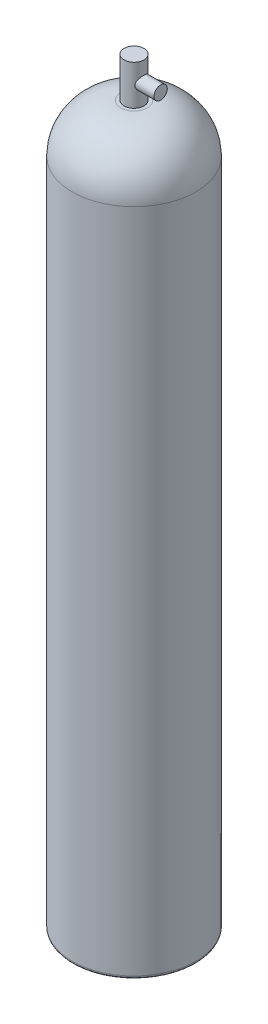
ISO-10303-21;
HEADER;
FILE_DESCRIPTION(('STEP AP214'),'2;1');
FILE_NAME('part.step','',(''),(''),'','','');
FILE_SCHEMA(('AUTOMOTIVE_DESIGN { 1 0 10303 214 1 1 1 1 }'));
ENDSEC;
DATA;
#1=APPLICATION_CONTEXT('core data for automotive mechanical design processes');
#2=APPLICATION_PROTOCOL_DEFINITION('international standard','automotive_design',2000,#1);
#3=PRODUCT_CONTEXT('',#1,'mechanical');
#4=PRODUCT('Part','Part','',(#3));
#5=PRODUCT_RELATED_PRODUCT_CATEGORY('part','',(#4));
#6=PRODUCT_DEFINITION_FORMATION('','',#4);
#7=PRODUCT_DEFINITION_CONTEXT('part definition',#1,'design');
#8=PRODUCT_DEFINITION('design','',#6,#7);
#9=PRODUCT_DEFINITION_SHAPE('','',#8);
#10=(LENGTH_UNIT() NAMED_UNIT(*) SI_UNIT(.MILLI.,.METRE.));
#11=(NAMED_UNIT(*) PLANE_ANGLE_UNIT() SI_UNIT($,.RADIAN.));
#12=(NAMED_UNIT(*) SI_UNIT($,.STERADIAN.) SOLID_ANGLE_UNIT());
#13=UNCERTAINTY_MEASURE_WITH_UNIT(LENGTH_MEASURE(1.E-05),#10,'distance_accuracy_value','');
#14=(GEOMETRIC_REPRESENTATION_CONTEXT(3) GLOBAL_UNCERTAINTY_ASSIGNED_CONTEXT((#13)) GLOBAL_UNIT_ASSIGNED_CONTEXT((#10,
#11,#12)) REPRESENTATION_CONTEXT('',''));
#15=CARTESIAN_POINT('',(0.,0.,0.));
#16=DIRECTION('',(0.,0.,1.));
#17=DIRECTION('',(1.,0.,0.));
#18=AXIS2_PLACEMENT_3D('',#15,#16,#17);
#19=CARTESIAN_POINT('',(0.,76.2,0.));
#20=DIRECTION('',(0.,-1.,0.));
#21=DIRECTION('',(0.,0.,-1.));
#22=AXIS2_PLACEMENT_3D('',#19,#20,#21);
#23=CYLINDRICAL_SURFACE('',#22,19.05);
#24=CARTESIAN_POINT('',(0.,76.2,0.));
#25=DIRECTION('',(0.,1.,0.));
#26=DIRECTION('',(0.,0.,1.));
#27=AXIS2_PLACEMENT_3D('',#24,#25,#26);
#28=CIRCLE('',#27,19.05);
#29=CARTESIAN_POINT('',(0.,76.2,19.05));
#30=VERTEX_POINT('',#29);
#31=EDGE_CURVE('E84',#30,#30,#28,.T.);
#32=ORIENTED_EDGE('',*,*,#31,.F.);
#33=EDGE_LOOP('',(#32));
#34=FACE_BOUND('',#33,.T.);
#35=CARTESIAN_POINT('',(0.,0.,0.));
#36=DIRECTION('',(0.,1.,0.));
#37=DIRECTION('',(0.,0.,1.));
#38=AXIS2_PLACEMENT_3D('',#35,#36,#37);
#39=CIRCLE('',#38,19.05);
#40=CARTESIAN_POINT('',(0.,0.,19.05));
#41=VERTEX_POINT('',#40);
#42=EDGE_CURVE('E85',#41,#41,#39,.T.);
#43=ORIENTED_EDGE('',*,*,#42,.T.);
#44=EDGE_LOOP('',(#43));
#45=FACE_BOUND('',#44,.T.);
#46=CARTESIAN_POINT('',(14.1990316571237,38.1,12.7));
#47=CARTESIAN_POINT('',(14.1990355477761,37.7899872950213,12.6999977119747));
#48=CARTESIAN_POINT('',(14.2092309200425,37.4799425619772,12.6886249705167));
#49=CARTESIAN_POINT('',(14.2495012052898,36.8627922269764,12.6433817788832));
#50=CARTESIAN_POINT('',(14.2795792883789,36.5556871016347,12.609507741087));
#51=CARTESIAN_POINT('',(14.3581974408301,35.946711483138,12.519912147887));
#52=CARTESIAN_POINT('',(14.406760895471,35.6448481290657,12.4641629160762));
#53=CARTESIAN_POINT('',(14.5202227787719,35.0487569980349,12.3317967460712));
#54=CARTESIAN_POINT('',(14.5851295599887,34.7545332104924,12.2551691359499));
#55=CARTESIAN_POINT('',(14.7280269513206,34.1783386222378,12.083048903963));
#56=CARTESIAN_POINT('',(14.8058800788646,33.8962746460555,11.9877528128264));
#57=CARTESIAN_POINT('',(14.9725417134117,33.342452875662,11.7789380708877));
#58=CARTESIAN_POINT('',(15.0613494562349,33.0706943642821,11.6654206910129));
#59=CARTESIAN_POINT('',(15.3405144685535,32.2717843195977,11.2988962671107));
#60=CARTESIAN_POINT('',(15.5436889269824,31.7607125913597,11.0198301654547));
#61=CARTESIAN_POINT('',(15.8766815235774,30.9922018334525,10.5299962431118));
#62=CARTESIAN_POINT('',(16.0012938260267,30.7187074358728,10.3400698069987));
#63=CARTESIAN_POINT('',(16.2529104163437,30.1880361644506,9.93987863185937));
#64=CARTESIAN_POINT('',(16.3799148653847,29.9308603952291,9.72961251845091));
#65=CARTESIAN_POINT('',(16.6335883637873,29.4334217554283,9.289288728591));
#66=CARTESIAN_POINT('',(16.7602569984574,29.1931746204292,9.05921306870562));
#67=CARTESIAN_POINT('',(17.0105433216136,28.7306946551863,8.58003424358432));
#68=CARTESIAN_POINT('',(17.1341607992447,28.5084630675249,8.33092976817566));
#69=CARTESIAN_POINT('',(17.3933444459709,28.0523092239843,7.77692783087647));
#70=CARTESIAN_POINT('',(17.5280504015542,27.8213503665257,7.46917349471749));
#71=CARTESIAN_POINT('',(17.7865722131684,27.3864470235338,6.83073663017676));
#72=CARTESIAN_POINT('',(17.9103867547745,27.1825057971108,6.50005134297316));
#73=CARTESIAN_POINT('',(18.1435064980697,26.8041374379189,5.81769120391199));
#74=CARTESIAN_POINT('',(18.25282381363,26.6296856299012,5.46603423679167));
#75=CARTESIAN_POINT('',(18.4537076105178,26.3126393102874,4.74379195423514));
#76=CARTESIAN_POINT('',(18.5452778935442,26.1700379748095,4.37321071422009));
#77=CARTESIAN_POINT('',(18.6985274729608,25.9332577330781,3.65865303784004));
#78=CARTESIAN_POINT('',(18.7624070649709,25.8354422626259,3.31635244132431));
#79=CARTESIAN_POINT('',(18.8719718522424,25.6684755281887,2.62195737916232));
#80=CARTESIAN_POINT('',(18.9176582748299,25.5993223306103,2.26986357588883));
#81=CARTESIAN_POINT('',(18.9894130682728,25.490997109658,1.55948915291248));
#82=CARTESIAN_POINT('',(19.0155019743679,25.4517937026884,1.2012154128157));
#83=CARTESIAN_POINT('',(19.0473096981091,25.4040228933948,0.481748521364582));
#84=CARTESIAN_POINT('',(19.0530313898859,25.3954511684636,0.120555789135989));
#85=CARTESIAN_POINT('',(19.0446325978915,25.4080527923981,-0.545977074000859));
#86=CARTESIAN_POINT('',(19.0334006962221,25.4248957870242,-0.851447575386737));
#87=CARTESIAN_POINT('',(18.9964510780532,25.4804481375924,-1.45947735526262));
#88=CARTESIAN_POINT('',(18.9707352314313,25.5191546709533,-1.76203700441655));
#89=CARTESIAN_POINT('',(18.9053955455089,25.6178989215728,-2.36212562431451));
#90=CARTESIAN_POINT('',(18.865771102762,25.67793756436,-2.65965437619799));
#91=CARTESIAN_POINT('',(18.7734723892474,25.818567730427,-3.2477434731375));
#92=CARTESIAN_POINT('',(18.7207975544984,25.899160141956,-3.53830351644082));
#93=CARTESIAN_POINT('',(18.6037334513632,26.0795555214519,-4.10953190541883));
#94=CARTESIAN_POINT('',(18.539395294205,26.179274777954,-4.39023727015804));
#95=CARTESIAN_POINT('',(18.4000604577252,26.3971482014366,-4.94178334563123));
#96=CARTESIAN_POINT('',(18.3250594990967,26.5153097717507,-5.21262004067534));
#97=CARTESIAN_POINT('',(18.1657788572552,26.7689470822118,-5.74314173477802));
#98=CARTESIAN_POINT('',(18.0815008874058,26.9044196259504,-6.00282878078201));
#99=CARTESIAN_POINT('',(17.9050657823116,27.191667130608,-6.51024515533807));
#100=CARTESIAN_POINT('',(17.8129077225684,27.3434440049012,-6.75797307548681));
#101=CARTESIAN_POINT('',(17.6096464815905,27.6832796444961,-7.27248710951177));
#102=CARTESIAN_POINT('',(17.4976449538365,27.8734853826612,-7.53750156276716));
#103=CARTESIAN_POINT('',(17.2676103315729,28.2722638195564,-8.0505395246595));
#104=CARTESIAN_POINT('',(17.1495767886972,28.4808378844594,-8.29856176703087));
#105=CARTESIAN_POINT('',(16.9095506630376,28.9155942928716,-8.77732290554606));
#106=CARTESIAN_POINT('',(16.7875527049811,29.1418011793699,-9.00803680171706));
#107=CARTESIAN_POINT('',(16.5420936769135,29.610696766113,-9.451233824735));
#108=CARTESIAN_POINT('',(16.4186324873918,29.8533868204012,-9.66371545060214));
#109=CARTESIAN_POINT('',(16.1536059099946,30.3934982097682,-10.1014214617723));
#110=CARTESIAN_POINT('',(16.0122081121928,30.6935645370027,-10.3234961380071));
#111=CARTESIAN_POINT('',(15.7348768703719,31.3139231811978,-10.741465175483));
#112=CARTESIAN_POINT('',(15.598944660608,31.6342200251553,-10.9373536462383));
#113=CARTESIAN_POINT('',(15.3373817323982,32.2936044986886,-11.3012099185556));
#114=CARTESIAN_POINT('',(15.2117350206893,32.6326615263828,-11.4692215013225));
#115=CARTESIAN_POINT('',(14.9755695053963,33.3290107518181,-11.7759209042205));
#116=CARTESIAN_POINT('',(14.8650513254962,33.6863037005142,-11.9146075155383));
#117=CARTESIAN_POINT('',(14.6932487422679,34.3128952985172,-12.125337008358));
#118=CARTESIAN_POINT('',(14.6269120441367,34.5782302744463,-12.2051062844318));
#119=CARTESIAN_POINT('',(14.5068128747686,35.1160854630437,-12.3476139793357));
#120=CARTESIAN_POINT('',(14.4530423751888,35.3886009636534,-12.4103632760973));
#121=CARTESIAN_POINT('',(14.3599410343511,35.9392318448987,-12.5179737523736));
#122=CARTESIAN_POINT('',(14.3205922015009,36.2173397884457,-12.5628572262605));
#123=CARTESIAN_POINT('',(14.2577504525483,36.7777157777781,-12.6341332919858));
#124=CARTESIAN_POINT('',(14.2342576005264,37.0599838403714,-12.6605258090948));
#125=CARTESIAN_POINT('',(14.2040397697773,37.6278128939306,-12.6944193254624));
#126=CARTESIAN_POINT('',(14.1973891922901,37.9133829170399,-12.7018365020652));
#127=CARTESIAN_POINT('',(14.201361825245,38.4842513447154,-12.6973946024109));
#128=CARTESIAN_POINT('',(14.2119850771048,38.7695497486285,-12.6855354799346));
#129=CARTESIAN_POINT('',(14.2500574639432,39.3377692284044,-12.6427517573922));
#130=CARTESIAN_POINT('',(14.2775185897538,39.6206884642984,-12.6118135703742));
#131=CARTESIAN_POINT('',(14.3481420972912,40.1818730891865,-12.5314071909787));
#132=CARTESIAN_POINT('',(14.3913047414846,40.4601384003043,-12.4819386888478));
#133=CARTESIAN_POINT('',(14.489217214069,40.9967353358915,-12.3681210318632));
#134=CARTESIAN_POINT('',(14.5432913974453,41.2553736111093,-12.3046250904215));
#135=CARTESIAN_POINT('',(14.6625158742504,41.7658563657545,-12.1623081382344));
#136=CARTESIAN_POINT('',(14.7276697441382,42.0176986209546,-12.0834821778633));
#137=CARTESIAN_POINT('',(14.8672938023423,42.5136798554984,-11.9112700126114));
#138=CARTESIAN_POINT('',(14.9417640877081,42.757818754563,-11.8178836560521));
#139=CARTESIAN_POINT('',(15.0982823186347,43.2378123171962,-11.6172526121013));
#140=CARTESIAN_POINT('',(15.1803305677684,43.4736666483626,-11.5100073694547));
#141=CARTESIAN_POINT('',(15.3673500795893,43.9830049095647,-11.2594899849706));
#142=CARTESIAN_POINT('',(15.4736237641214,44.2545791484564,-11.1133024472384));
#143=CARTESIAN_POINT('',(15.6919824554123,44.7846190753225,-10.8027872808332));
#144=CARTESIAN_POINT('',(15.8040668729184,45.0430860872321,-10.6384614896169));
#145=CARTESIAN_POINT('',(16.0317421358971,45.5467970016321,-10.2921683337638));
#146=CARTESIAN_POINT('',(16.1473369620237,45.792024944653,-10.1101803854789));
#147=CARTESIAN_POINT('',(16.3796422687146,46.2684409335803,-9.72931613350424));
#148=CARTESIAN_POINT('',(16.4963528235971,46.4996280365823,-9.53043869775697));
#149=CARTESIAN_POINT('',(16.754205034675,46.9963645561403,-9.07098830166778));
#150=CARTESIAN_POINT('',(16.8951083913352,47.2583735307435,-8.80643397023191));
#151=CARTESIAN_POINT('',(17.1718547866494,47.7593835131024,-8.25381279938454));
#152=CARTESIAN_POINT('',(17.3076968913322,47.9983802870991,-7.96574165132105));
#153=CARTESIAN_POINT('',(17.5707751223947,48.4515039111279,-7.36730077482963));
#154=CARTESIAN_POINT('',(17.6980171514121,48.6656478927036,-7.05694664826808));
#155=CARTESIAN_POINT('',(17.9406496729912,49.0672240249653,-6.41507721674435));
#156=CARTESIAN_POINT('',(18.0560433411041,49.2546633381785,-6.08356762061476));
#157=CARTESIAN_POINT('',(18.2510646959212,49.5673785745003,-5.46669676297043));
#158=CARTESIAN_POINT('',(18.3333051949628,49.697679664671,-5.18469943532757));
#159=CARTESIAN_POINT('',(18.4863651117792,49.9381502010247,-4.60927210438543));
#160=CARTESIAN_POINT('',(18.5571866547232,50.0483233936975,-4.3158442410609));
#161=CARTESIAN_POINT('',(18.6858959098005,50.2472612410577,-3.71925383964936));
#162=CARTESIAN_POINT('',(18.7437918253559,50.3360394771996,-3.4160976163483));
#163=CARTESIAN_POINT('',(18.8454148566246,50.4911499479169,-2.80174292673661));
#164=CARTESIAN_POINT('',(18.889141766789,50.5574818568657,-2.49054434382675));
#165=CARTESIAN_POINT('',(18.9615516104168,50.6670059340202,-1.8608936687482));
#166=CARTESIAN_POINT('',(18.9901658516493,50.7100924627792,-1.54241520617452));
#167=CARTESIAN_POINT('',(19.0313346981918,50.7720060272893,-0.902067548621483));
#168=CARTESIAN_POINT('',(19.0438892780765,50.7908330246331,-0.580198348274775));
#169=CARTESIAN_POINT('',(19.0526169873602,50.8039260730717,0.0642425642359377));
#170=CARTESIAN_POINT('',(19.048791092655,50.7981935873412,0.386814233404731));
#171=CARTESIAN_POINT('',(19.0248575720477,50.7622622966344,1.02996992718405));
#172=CARTESIAN_POINT('',(19.004750687129,50.7320646051231,1.35055404158346));
#173=CARTESIAN_POINT('',(18.9508120892955,50.6507619354675,1.9639278428213));
#174=CARTESIAN_POINT('',(18.918086957392,50.6013403427321,2.25704095456273));
#175=CARTESIAN_POINT('',(18.8397801082726,50.482520397682,2.83741433056512));
#176=CARTESIAN_POINT('',(18.7941991383882,50.4131232065778,3.12467493400177));
#177=CARTESIAN_POINT('',(18.6910944831845,50.2551672505528,3.69168495361533));
#178=CARTESIAN_POINT('',(18.633570046551,50.1666072801659,3.97143389601384));
#179=CARTESIAN_POINT('',(18.5076731579046,49.9712695423986,4.52197844704447));
#180=CARTESIAN_POINT('',(18.4393001334196,49.8644908136051,4.792773582279));
#181=CARTESIAN_POINT('',(18.2886954462102,49.6270459811257,5.33958025126296));
#182=CARTESIAN_POINT('',(18.2058912541581,49.4953560663641,5.61498894523602));
#183=CARTESIAN_POINT('',(18.0310588120422,49.2138986991832,6.15333506036213));
#184=CARTESIAN_POINT('',(17.9390303008849,49.0641307350417,6.41627212819639));
#185=CARTESIAN_POINT('',(17.7473233735042,48.7475753190127,6.92892031909448));
#186=CARTESIAN_POINT('',(17.6476416999484,48.5807806101502,7.17862573323289));
#187=CARTESIAN_POINT('',(17.4423183553178,48.2312376481454,7.66403923380802));
#188=CARTESIAN_POINT('',(17.3366760163395,48.048487605918,7.89974574554408));
#189=CARTESIAN_POINT('',(17.1041539294204,47.6379534305166,8.39260859135741));
#190=CARTESIAN_POINT('',(16.9765500537505,47.4076099522901,8.64729551520523));
#191=CARTESIAN_POINT('',(16.7184152449093,46.928009322408,9.13638558640353));
#192=CARTESIAN_POINT('',(16.587885144478,46.6787575047049,9.37079441446595));
#193=CARTESIAN_POINT('',(16.326603993388,46.1619634912939,9.81895297420551));
#194=CARTESIAN_POINT('',(16.1958528502675,45.8944044012447,10.032683171989));
#195=CARTESIAN_POINT('',(15.9373477314989,45.3419708143651,10.4384531027142));
#196=CARTESIAN_POINT('',(15.8095934665382,45.0570979985803,10.630494936291));
#197=CARTESIAN_POINT('',(15.5699604313031,44.4930636288686,10.9781578665313));
#198=CARTESIAN_POINT('',(15.4576141197423,44.2151248848946,11.1354398834009));
#199=CARTESIAN_POINT('',(15.2412690277955,43.6455537616751,11.4297672616962));
#200=CARTESIAN_POINT('',(15.1372704986612,43.3539209706843,11.5668120141246));
#201=CARTESIAN_POINT('',(14.9409666416922,42.758210471549,11.8192875014913));
#202=CARTESIAN_POINT('',(14.8486427704248,42.4541535402893,11.9347526554442));
#203=CARTESIAN_POINT('',(14.6788631371643,41.8343324228436,12.1429630764628));
#204=CARTESIAN_POINT('',(14.6014033277399,41.5185714516478,12.2357145302937));
#205=CARTESIAN_POINT('',(14.4798250367908,40.9482180775818,12.3791734354968));
#206=CARTESIAN_POINT('',(14.4321219449257,40.6955800809363,12.4346431735284));
#207=CARTESIAN_POINT('',(14.3491541592005,40.1854298707926,12.5302951569388));
#208=CARTESIAN_POINT('',(14.313887030351,39.9279186219041,12.5704803951779));
#209=CARTESIAN_POINT('',(14.256971537846,39.4095898460053,12.6349960069851));
#210=CARTESIAN_POINT('',(14.2353138765316,39.1487747006771,12.6593372052263));
#211=CARTESIAN_POINT('',(14.2063414165248,38.6253141800988,12.6918411539603));
#212=CARTESIAN_POINT('',(14.1990283606388,38.362668586347,12.7000019386056));
#213=CARTESIAN_POINT('',(14.1990316571237,38.1,12.7));
#214=B_SPLINE_CURVE_WITH_KNOTS('',3,(#46,#47,#48,#49,#50,#51,#52,#53,#54,#55,#56,#57,#58,#59,
#60,#61,#62,#63,#64,#65,#66,#67,#68,#69,#70,#71,#72,#73,#74,#75,#76,#77,#78,#79,#80,#81,#82,#83,
#84,#85,#86,#87,#88,#89,#90,#91,#92,#93,#94,#95,#96,#97,#98,#99,#100,#101,#102,#103,#104,#105,
#106,#107,#108,#109,#110,#111,#112,#113,#114,#115,#116,#117,#118,#119,#120,#121,#122,#123,#124,
#125,#126,#127,#128,#129,#130,#131,#132,#133,#134,#135,#136,#137,#138,#139,#140,#141,#142,#143,
#144,#145,#146,#147,#148,#149,#150,#151,#152,#153,#154,#155,#156,#157,#158,#159,#160,#161,#162,
#163,#164,#165,#166,#167,#168,#169,#170,#171,#172,#173,#174,#175,#176,#177,#178,#179,#180,#181,
#182,#183,#184,#185,#186,#187,#188,#189,#190,#191,#192,#193,#194,#195,#196,#197,#198,#199,#200,
#201,#202,#203,#204,#205,#206,#207,#208,#209,#210,#211,#212,#213),.UNSPECIFIED.,.T.,.F.,(4,2,2,
2,2,2,2,2,2,2,2,2,2,2,2,2,2,2,2,2,2,2,2,2,2,2,2,2,2,2,2,2,2,2,2,2,2,2,2,2,2,2,2,2,2,2,2,2,2,2,2,
2,2,2,2,2,2,2,2,2,2,2,2,2,2,2,2,2,2,2,2,2,2,2,2,2,2,2,2,2,2,2,2,4),(0.,0.929724985033371,
1.85959824159105,2.79065178319566,3.72218212602978,4.64438721688073,5.56652801224052,
7.40989441344304,8.47573452469243,9.54164670671941,10.6085369553517,11.6755007278773,
12.896893347469,14.1184331685655,15.338945752574,16.5591965935276,17.6426278819671,
18.7259860688539,19.8082074702286,20.8902761472809,21.8075855174087,22.7247764900156,
23.6420072613144,24.5592776782625,25.4726215344035,26.3863329834432,27.2998759621117,
28.2135262658309,29.2472033664089,30.2809574133711,31.316176949052,32.3514816280397,
33.5476470315829,34.7440810567517,35.938617898654,37.1332039713215,37.9871169758521,
38.8404829284425,39.6927806204306,40.5450817568774,41.4011414423011,42.2572031803221,
43.1138752586861,43.9705616578484,44.7850409725959,45.5997836973728,46.4145349100561,
47.2293187758013,48.2070800675588,49.1847424000557,50.1635581133743,51.1424394859756,
52.3353710153325,53.5285216012247,54.7208447763315,55.9128475509179,56.8759322718262,
57.8388375466958,58.8011299525178,59.7634363176215,60.7300798474467,61.6967249076442,
62.6633123790515,63.6298558614192,64.525985630228,65.4220633162338,66.3181973878691,
67.2143787635794,68.1623478921283,69.110343860442,70.0587455749196,71.0072537714002,
72.1051657078547,73.2027690721235,74.3013993569078,75.3999231420025,76.4146255474231,
77.4293584819307,78.4424588619745,79.4552829857038,80.2436212449891,81.0318050600613,
81.8194498199268,82.607190269232),.UNSPECIFIED.);
#215=CARTESIAN_POINT('',(14.1990316571237,38.1,12.7));
#216=VERTEX_POINT('',#215);
#217=EDGE_CURVE('E10',#216,#216,#214,.T.);
#218=ORIENTED_EDGE('',*,*,#217,.F.);
#219=EDGE_LOOP('',(#218));
#220=FACE_BOUND('',#219,.T.);
#221=ADVANCED_FACE('F38',(#34,#45,#220),#23,.T.);
#222=CARTESIAN_POINT('',(0.,-1371.6,0.));
#223=DIRECTION('',(0.,-1.,0.));
#224=DIRECTION('',(0.,0.,-1.));
#225=AXIS2_PLACEMENT_3D('',#222,#223,#224);
#226=PLANE('',#225);
#227=CARTESIAN_POINT('',(0.,-1371.6,0.));
#228=DIRECTION('',(0.,-1.,0.));
#229=DIRECTION('',(0.,0.,-1.));
#230=AXIS2_PLACEMENT_3D('',#227,#228,#229);
#231=CIRCLE('',#230,111.76);
#232=CARTESIAN_POINT('',(0.,-1371.6,-111.76));
#233=VERTEX_POINT('',#232);
#234=EDGE_CURVE('E52',#233,#233,#231,.T.);
#235=ORIENTED_EDGE('',*,*,#234,.T.);
#236=EDGE_LOOP('',(#235));
#237=FACE_BOUND('',#236,.T.);
#238=ADVANCED_FACE('F40',(#237),#226,.T.);
#239=CARTESIAN_POINT('',(0.,-1365.25,0.));
#240=DIRECTION('',(0.,-1.,0.));
#241=DIRECTION('',(0.,0.,-1.));
#242=AXIS2_PLACEMENT_3D('',#239,#240,#241);
#243=TOROIDAL_SURFACE('',#242,111.76,6.35000000000015);
#244=CARTESIAN_POINT('',(0.,-1365.25,0.));
#245=DIRECTION('',(0.,-1.,0.));
#246=DIRECTION('',(0.,0.,-1.));
#247=AXIS2_PLACEMENT_3D('',#244,#245,#246);
#248=CIRCLE('',#247,118.11);
#249=CARTESIAN_POINT('',(0.,-1365.25,-118.11));
#250=VERTEX_POINT('',#249);
#251=EDGE_CURVE('E57',#250,#250,#248,.T.);
#252=ORIENTED_EDGE('',*,*,#251,.T.);
#253=EDGE_LOOP('',(#252));
#254=FACE_BOUND('',#253,.T.);
#255=ORIENTED_EDGE('',*,*,#234,.F.);
#256=EDGE_LOOP('',(#255));
#257=FACE_BOUND('',#256,.T.);
#258=ADVANCED_FACE('F116',(#254,#257),#243,.T.);
#259=CARTESIAN_POINT('',(0.,-1371.6,0.));
#260=DIRECTION('',(0.,-1.,0.));
#261=DIRECTION('',(0.,0.,-1.));
#262=AXIS2_PLACEMENT_3D('',#259,#260,#261);
#263=CYLINDRICAL_SURFACE('',#262,118.11);
#264=CARTESIAN_POINT('',(0.,-92.7100000000001,0.));
#265=DIRECTION('',(0.,-1.,0.));
#266=DIRECTION('',(0.,0.,-1.));
#267=AXIS2_PLACEMENT_3D('',#264,#265,#266);
#268=CIRCLE('',#267,118.11);
#269=CARTESIAN_POINT('',(0.,-92.7100000000001,-118.11));
#270=VERTEX_POINT('',#269);
#271=EDGE_CURVE('E62',#270,#270,#268,.T.);
#272=ORIENTED_EDGE('',*,*,#271,.T.);
#273=EDGE_LOOP('',(#272));
#274=FACE_BOUND('',#273,.T.);
#275=ORIENTED_EDGE('',*,*,#251,.F.);
#276=EDGE_LOOP('',(#275));
#277=FACE_BOUND('',#276,.T.);
#278=ADVANCED_FACE('F144',(#274,#277),#263,.T.);
#279=CARTESIAN_POINT('',(0.,-92.71,0.));
#280=DIRECTION('',(0.,-1.,0.));
#281=DIRECTION('',(0.,0.,-1.));
#282=AXIS2_PLACEMENT_3D('',#279,#280,#281);
#283=DEGENERATE_TOROIDAL_SURFACE('',#282,25.4,92.71,.T.);
#284=CARTESIAN_POINT('',(0.,0.,0.));
#285=DIRECTION('',(0.,-1.,0.));
#286=DIRECTION('',(0.,0.,-1.));
#287=AXIS2_PLACEMENT_3D('',#284,#285,#286);
#288=CIRCLE('',#287,25.4);
#289=CARTESIAN_POINT('',(0.,0.,-25.4));
#290=VERTEX_POINT('',#289);
#291=EDGE_CURVE('E68',#290,#290,#288,.T.);
#292=ORIENTED_EDGE('',*,*,#291,.T.);
#293=EDGE_LOOP('',(#292));
#294=FACE_BOUND('',#293,.T.);
#295=ORIENTED_EDGE('',*,*,#271,.F.);
#296=EDGE_LOOP('',(#295));
#297=FACE_BOUND('',#296,.T.);
#298=ADVANCED_FACE('F140',(#294,#297),#283,.T.);
#299=CARTESIAN_POINT('',(25.4,0.,0.));
#300=DIRECTION('',(0.,1.,0.));
#301=DIRECTION('',(0.,0.,1.));
#302=AXIS2_PLACEMENT_3D('',#299,#300,#301);
#303=PLANE('',#302);
#304=ORIENTED_EDGE('',*,*,#42,.F.);
#305=EDGE_LOOP('',(#304));
#306=FACE_BOUND('',#305,.T.);
#307=ORIENTED_EDGE('',*,*,#291,.F.);
#308=EDGE_LOOP('',(#307));
#309=FACE_BOUND('',#308,.T.);
#310=ADVANCED_FACE('F107',(#306,#309),#303,.T.);
#311=CARTESIAN_POINT('',(0.,76.2,0.));
#312=DIRECTION('',(0.,1.,0.));
#313=DIRECTION('',(0.,0.,1.));
#314=AXIS2_PLACEMENT_3D('',#311,#312,#313);
#315=PLANE('',#314);
#316=ORIENTED_EDGE('',*,*,#31,.T.);
#317=EDGE_LOOP('',(#316));
#318=FACE_BOUND('',#317,.T.);
#319=ADVANCED_FACE('F101',(#318),#315,.T.);
#320=CARTESIAN_POINT('',(50.8,38.1,0.));
#321=DIRECTION('',(-1.,0.,0.));
#322=DIRECTION('',(0.,0.,1.));
#323=AXIS2_PLACEMENT_3D('',#320,#321,#322);
#324=CYLINDRICAL_SURFACE('',#323,12.7);
#325=CARTESIAN_POINT('',(50.8,38.1,0.));
#326=DIRECTION('',(1.,0.,0.));
#327=DIRECTION('',(0.,0.,-1.));
#328=AXIS2_PLACEMENT_3D('',#325,#326,#327);
#329=CIRCLE('',#328,12.7);
#330=CARTESIAN_POINT('',(50.8,38.1,-12.7));
#331=VERTEX_POINT('',#330);
#332=EDGE_CURVE('E89',#331,#331,#329,.T.);
#333=ORIENTED_EDGE('',*,*,#332,.F.);
#334=EDGE_LOOP('',(#333));
#335=FACE_BOUND('',#334,.T.);
#336=ORIENTED_EDGE('',*,*,#217,.T.);
#337=EDGE_LOOP('',(#336));
#338=FACE_BOUND('',#337,.T.);
#339=ADVANCED_FACE('F99',(#335,#338),#324,.T.);
#340=CARTESIAN_POINT('',(50.8,38.1,0.));
#341=DIRECTION('',(1.,0.,0.));
#342=DIRECTION('',(0.,0.,-1.));
#343=AXIS2_PLACEMENT_3D('',#340,#341,#342);
#344=PLANE('',#343);
#345=ORIENTED_EDGE('',*,*,#332,.T.);
#346=EDGE_LOOP('',(#345));
#347=FACE_BOUND('',#346,.T.);
#348=ADVANCED_FACE('F97',(#347),#344,.T.);
#349=CLOSED_SHELL('',(#221,#238,#258,#278,#298,#310,#319,#339,#348));
#350=CARTESIAN_POINT('',(0.,-12.7,0.));
#351=DIRECTION('',(0.,-1.,0.));
#352=DIRECTION('',(0.,0.,-1.));
#353=AXIS2_PLACEMENT_3D('',#350,#351,#352);
#354=PLANE('',#353);
#355=CARTESIAN_POINT('',(0.,-12.6999999999999,0.));
#356=DIRECTION('',(0.,-1.,0.));
#357=DIRECTION('',(0.,0.,-1.));
#358=AXIS2_PLACEMENT_3D('',#355,#356,#357);
#359=CIRCLE('',#358,25.4);
#360=CARTESIAN_POINT('',(0.,-12.6999999999999,-25.4));
#361=VERTEX_POINT('',#360);
#362=EDGE_CURVE('E72',#361,#361,#359,.T.);
#363=ORIENTED_EDGE('',*,*,#362,.T.);
#364=EDGE_LOOP('',(#363));
#365=FACE_BOUND('',#364,.T.);
#366=ADVANCED_FACE('F133',(#365),#354,.T.);
#367=CARTESIAN_POINT('',(0.,-92.71,0.));
#368=DIRECTION('',(0.,-1.,0.));
#369=DIRECTION('',(0.,0.,-1.));
#370=AXIS2_PLACEMENT_3D('',#367,#368,#369);
#371=DEGENERATE_TOROIDAL_SURFACE('',#370,25.4,80.01,.T.);
#372=CARTESIAN_POINT('',(0.,-92.7100000000001,0.));
#373=DIRECTION('',(0.,-1.,0.));
#374=DIRECTION('',(0.,0.,-1.));
#375=AXIS2_PLACEMENT_3D('',#372,#373,#374);
#376=CIRCLE('',#375,105.41);
#377=CARTESIAN_POINT('',(0.,-92.7100000000001,-105.41));
#378=VERTEX_POINT('',#377);
#379=EDGE_CURVE('E76',#378,#378,#376,.T.);
#380=ORIENTED_EDGE('',*,*,#379,.T.);
#381=EDGE_LOOP('',(#380));
#382=FACE_BOUND('',#381,.T.);
#383=ORIENTED_EDGE('',*,*,#362,.F.);
#384=EDGE_LOOP('',(#383));
#385=FACE_BOUND('',#384,.T.);
#386=ADVANCED_FACE('F129',(#382,#385),#371,.F.);
#387=CARTESIAN_POINT('',(0.,-1371.6,0.));
#388=DIRECTION('',(0.,-1.,0.));
#389=DIRECTION('',(0.,0.,-1.));
#390=AXIS2_PLACEMENT_3D('',#387,#388,#389);
#391=CYLINDRICAL_SURFACE('',#390,105.41);
#392=CARTESIAN_POINT('',(0.,-1358.9,0.));
#393=DIRECTION('',(0.,-1.,0.));
#394=DIRECTION('',(0.,0.,-1.));
#395=AXIS2_PLACEMENT_3D('',#392,#393,#394);
#396=CIRCLE('',#395,105.41);
#397=CARTESIAN_POINT('',(0.,-1358.9,-105.41));
#398=VERTEX_POINT('',#397);
#399=EDGE_CURVE('E80',#398,#398,#396,.T.);
#400=ORIENTED_EDGE('',*,*,#399,.T.);
#401=EDGE_LOOP('',(#400));
#402=FACE_BOUND('',#401,.T.);
#403=ORIENTED_EDGE('',*,*,#379,.F.);
#404=EDGE_LOOP('',(#403));
#405=FACE_BOUND('',#404,.T.);
#406=ADVANCED_FACE('F124',(#402,#405),#391,.F.);
#407=CARTESIAN_POINT('',(0.,-1358.9,0.));
#408=DIRECTION('',(0.,1.,0.));
#409=DIRECTION('',(0.,0.,1.));
#410=AXIS2_PLACEMENT_3D('',#407,#408,#409);
#411=PLANE('',#410);
#412=ORIENTED_EDGE('',*,*,#399,.F.);
#413=EDGE_LOOP('',(#412));
#414=FACE_BOUND('',#413,.T.);
#415=ADVANCED_FACE('F121',(#414),#411,.T.);
#416=CLOSED_SHELL('',(#366,#386,#406,#415));
#417=ORIENTED_CLOSED_SHELL('',*,#416,.T.);
#418=BREP_WITH_VOIDS('B2',#349,(#417));
#419=ADVANCED_BREP_SHAPE_REPRESENTATION('',(#18,#418),#14);
#420=SHAPE_DEFINITION_REPRESENTATION(#9,#419);
ENDSEC;
END-ISO-10303-21;
